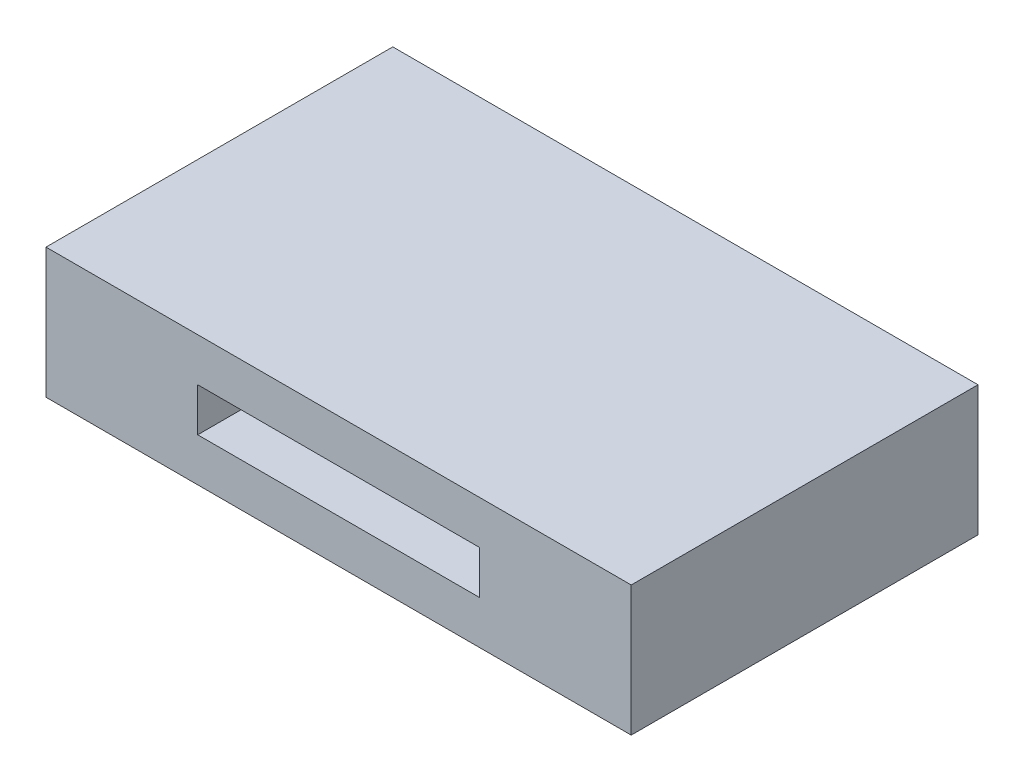
ISO-10303-21;
HEADER;
FILE_DESCRIPTION(('STEP AP214'),'2;1');
FILE_NAME('part.step','',(''),(''),'','','');
FILE_SCHEMA(('AUTOMOTIVE_DESIGN { 1 0 10303 214 1 1 1 1 }'));
ENDSEC;
DATA;
#1=APPLICATION_CONTEXT('core data for automotive mechanical design processes');
#2=APPLICATION_PROTOCOL_DEFINITION('international standard','automotive_design',2000,#1);
#3=PRODUCT_CONTEXT('',#1,'mechanical');
#4=PRODUCT('Part','Part','',(#3));
#5=PRODUCT_RELATED_PRODUCT_CATEGORY('part','',(#4));
#6=PRODUCT_DEFINITION_FORMATION('','',#4);
#7=PRODUCT_DEFINITION_CONTEXT('part definition',#1,'design');
#8=PRODUCT_DEFINITION('design','',#6,#7);
#9=PRODUCT_DEFINITION_SHAPE('','',#8);
#10=(LENGTH_UNIT() NAMED_UNIT(*) SI_UNIT(.MILLI.,.METRE.));
#11=(NAMED_UNIT(*) PLANE_ANGLE_UNIT() SI_UNIT($,.RADIAN.));
#12=(NAMED_UNIT(*) SI_UNIT($,.STERADIAN.) SOLID_ANGLE_UNIT());
#13=UNCERTAINTY_MEASURE_WITH_UNIT(LENGTH_MEASURE(1.E-05),#10,'distance_accuracy_value','');
#14=(GEOMETRIC_REPRESENTATION_CONTEXT(3) GLOBAL_UNCERTAINTY_ASSIGNED_CONTEXT((#13)) GLOBAL_UNIT_ASSIGNED_CONTEXT((#10,
#11,#12)) REPRESENTATION_CONTEXT('',''));
#15=CARTESIAN_POINT('',(0.,0.,0.));
#16=DIRECTION('',(0.,0.,1.));
#17=DIRECTION('',(1.,0.,0.));
#18=AXIS2_PLACEMENT_3D('',#15,#16,#17);
#19=CARTESIAN_POINT('',(0.,0.,16.));
#20=DIRECTION('',(0.,0.,-1.));
#21=DIRECTION('',(-1.,0.,0.));
#22=AXIS2_PLACEMENT_3D('',#19,#20,#21);
#23=PLANE('',#22);
#24=DIRECTION('',(0.,1.,0.));
#25=VECTOR('',#24,1.);
#26=CARTESIAN_POINT('',(13.5,-3.,16.));
#27=LINE('',#26,#25);
#28=CARTESIAN_POINT('',(13.5,-3.,16.));
#29=VERTEX_POINT('',#28);
#30=CARTESIAN_POINT('',(13.5,3.,16.));
#31=VERTEX_POINT('',#30);
#32=EDGE_CURVE('E153',#29,#31,#27,.T.);
#33=ORIENTED_EDGE('',*,*,#32,.T.);
#34=DIRECTION('',(-1.,0.,0.));
#35=VECTOR('',#34,1.);
#36=CARTESIAN_POINT('',(-13.5,3.,16.));
#37=LINE('',#36,#35);
#38=CARTESIAN_POINT('',(-13.5,3.,16.));
#39=VERTEX_POINT('',#38);
#40=EDGE_CURVE('E157',#31,#39,#37,.T.);
#41=ORIENTED_EDGE('',*,*,#40,.T.);
#42=DIRECTION('',(0.,-1.,0.));
#43=VECTOR('',#42,1.);
#44=CARTESIAN_POINT('',(-13.5,-3.,16.));
#45=LINE('',#44,#43);
#46=CARTESIAN_POINT('',(-13.5,-3.,16.));
#47=VERTEX_POINT('',#46);
#48=EDGE_CURVE('E161',#39,#47,#45,.T.);
#49=ORIENTED_EDGE('',*,*,#48,.T.);
#50=DIRECTION('',(1.,0.,0.));
#51=VECTOR('',#50,1.);
#52=CARTESIAN_POINT('',(-13.5,-3.,16.));
#53=LINE('',#52,#51);
#54=EDGE_CURVE('E164',#47,#29,#53,.T.);
#55=ORIENTED_EDGE('',*,*,#54,.T.);
#56=EDGE_LOOP('',(#33,#41,#49,#55));
#57=FACE_BOUND('',#56,.T.);
#58=DIRECTION('',(0.,1.,0.));
#59=VECTOR('',#58,1.);
#60=CARTESIAN_POINT('',(6.5,-1.,16.));
#61=LINE('',#60,#59);
#62=CARTESIAN_POINT('',(6.5,-1.,16.));
#63=VERTEX_POINT('',#62);
#64=CARTESIAN_POINT('',(6.5,1.,16.));
#65=VERTEX_POINT('',#64);
#66=EDGE_CURVE('E105',#63,#65,#61,.T.);
#67=ORIENTED_EDGE('',*,*,#66,.F.);
#68=DIRECTION('',(1.,0.,0.));
#69=VECTOR('',#68,1.);
#70=CARTESIAN_POINT('',(-6.5,-1.,16.));
#71=LINE('',#70,#69);
#72=CARTESIAN_POINT('',(-6.5,-1.,16.));
#73=VERTEX_POINT('',#72);
#74=EDGE_CURVE('E131',#73,#63,#71,.T.);
#75=ORIENTED_EDGE('',*,*,#74,.F.);
#76=DIRECTION('',(0.,-1.,0.));
#77=VECTOR('',#76,1.);
#78=CARTESIAN_POINT('',(-6.5,-1.,16.));
#79=LINE('',#78,#77);
#80=CARTESIAN_POINT('',(-6.5,1.,16.));
#81=VERTEX_POINT('',#80);
#82=EDGE_CURVE('E127',#81,#73,#79,.T.);
#83=ORIENTED_EDGE('',*,*,#82,.F.);
#84=DIRECTION('',(-1.,0.,0.));
#85=VECTOR('',#84,1.);
#86=CARTESIAN_POINT('',(-6.5,1.,16.));
#87=LINE('',#86,#85);
#88=EDGE_CURVE('E114',#65,#81,#87,.T.);
#89=ORIENTED_EDGE('',*,*,#88,.F.);
#90=EDGE_LOOP('',(#67,#75,#83,#89));
#91=FACE_BOUND('',#90,.T.);
#92=ADVANCED_FACE('F39',(#57,#91),#23,.F.);
#93=CARTESIAN_POINT('',(0.,0.,0.));
#94=DIRECTION('',(0.,0.,-1.));
#95=DIRECTION('',(-1.,0.,0.));
#96=AXIS2_PLACEMENT_3D('',#93,#94,#95);
#97=PLANE('',#96);
#98=DIRECTION('',(0.,1.,0.));
#99=VECTOR('',#98,1.);
#100=CARTESIAN_POINT('',(13.5,-3.,0.));
#101=LINE('',#100,#99);
#102=CARTESIAN_POINT('',(13.5,-3.,0.));
#103=VERTEX_POINT('',#102);
#104=CARTESIAN_POINT('',(13.5,3.,0.));
#105=VERTEX_POINT('',#104);
#106=EDGE_CURVE('E123',#103,#105,#101,.T.);
#107=ORIENTED_EDGE('',*,*,#106,.F.);
#108=DIRECTION('',(1.,0.,0.));
#109=VECTOR('',#108,1.);
#110=CARTESIAN_POINT('',(-13.5,-3.,0.));
#111=LINE('',#110,#109);
#112=CARTESIAN_POINT('',(-13.5,-3.,0.));
#113=VERTEX_POINT('',#112);
#114=EDGE_CURVE('E158',#113,#103,#111,.T.);
#115=ORIENTED_EDGE('',*,*,#114,.F.);
#116=DIRECTION('',(0.,-1.,0.));
#117=VECTOR('',#116,1.);
#118=CARTESIAN_POINT('',(-13.5,-3.,0.));
#119=LINE('',#118,#117);
#120=CARTESIAN_POINT('',(-13.5,3.,0.));
#121=VERTEX_POINT('',#120);
#122=EDGE_CURVE('E174',#121,#113,#119,.T.);
#123=ORIENTED_EDGE('',*,*,#122,.F.);
#124=DIRECTION('',(-1.,0.,0.));
#125=VECTOR('',#124,1.);
#126=CARTESIAN_POINT('',(-13.5,3.,0.));
#127=LINE('',#126,#125);
#128=EDGE_CURVE('E171',#105,#121,#127,.T.);
#129=ORIENTED_EDGE('',*,*,#128,.F.);
#130=EDGE_LOOP('',(#107,#115,#123,#129));
#131=FACE_BOUND('',#130,.T.);
#132=DIRECTION('',(1.,0.,0.));
#133=VECTOR('',#132,1.);
#134=CARTESIAN_POINT('',(-6.5,-1.,0.));
#135=LINE('',#134,#133);
#136=CARTESIAN_POINT('',(-6.5,-1.,0.));
#137=VERTEX_POINT('',#136);
#138=CARTESIAN_POINT('',(6.5,-1.,0.));
#139=VERTEX_POINT('',#138);
#140=EDGE_CURVE('E115',#137,#139,#135,.T.);
#141=ORIENTED_EDGE('',*,*,#140,.T.);
#142=DIRECTION('',(0.,1.,0.));
#143=VECTOR('',#142,1.);
#144=CARTESIAN_POINT('',(6.5,-1.,0.));
#145=LINE('',#144,#143);
#146=CARTESIAN_POINT('',(6.5,1.,0.));
#147=VERTEX_POINT('',#146);
#148=EDGE_CURVE('E63',#139,#147,#145,.T.);
#149=ORIENTED_EDGE('',*,*,#148,.T.);
#150=DIRECTION('',(-1.,0.,0.));
#151=VECTOR('',#150,1.);
#152=CARTESIAN_POINT('',(-6.5,1.,0.));
#153=LINE('',#152,#151);
#154=CARTESIAN_POINT('',(-6.5,1.,0.));
#155=VERTEX_POINT('',#154);
#156=EDGE_CURVE('E121',#147,#155,#153,.T.);
#157=ORIENTED_EDGE('',*,*,#156,.T.);
#158=DIRECTION('',(0.,-1.,0.));
#159=VECTOR('',#158,1.);
#160=CARTESIAN_POINT('',(-6.5,-1.,0.));
#161=LINE('',#160,#159);
#162=EDGE_CURVE('E140',#155,#137,#161,.T.);
#163=ORIENTED_EDGE('',*,*,#162,.T.);
#164=EDGE_LOOP('',(#141,#149,#157,#163));
#165=FACE_BOUND('',#164,.T.);
#166=ADVANCED_FACE('F197',(#131,#165),#97,.T.);
#167=CARTESIAN_POINT('',(13.5,-3.,16.));
#168=DIRECTION('',(-1.,0.,0.));
#169=DIRECTION('',(0.,0.,1.));
#170=AXIS2_PLACEMENT_3D('',#167,#168,#169);
#171=PLANE('',#170);
#172=ORIENTED_EDGE('',*,*,#106,.T.);
#173=DIRECTION('',(0.,0.,-1.));
#174=VECTOR('',#173,1.);
#175=CARTESIAN_POINT('',(13.5,3.,16.));
#176=LINE('',#175,#174);
#177=EDGE_CURVE('E11',#31,#105,#176,.T.);
#178=ORIENTED_EDGE('',*,*,#177,.F.);
#179=ORIENTED_EDGE('',*,*,#32,.F.);
#180=DIRECTION('',(0.,0.,-1.));
#181=VECTOR('',#180,1.);
#182=CARTESIAN_POINT('',(13.5,-3.,16.));
#183=LINE('',#182,#181);
#184=EDGE_CURVE('E167',#29,#103,#183,.T.);
#185=ORIENTED_EDGE('',*,*,#184,.T.);
#186=EDGE_LOOP('',(#172,#178,#179,#185));
#187=FACE_BOUND('',#186,.T.);
#188=ADVANCED_FACE('F41',(#187),#171,.F.);
#189=CARTESIAN_POINT('',(-13.5,3.,16.));
#190=DIRECTION('',(0.,-1.,0.));
#191=DIRECTION('',(0.,0.,-1.));
#192=AXIS2_PLACEMENT_3D('',#189,#190,#191);
#193=PLANE('',#192);
#194=ORIENTED_EDGE('',*,*,#128,.T.);
#195=DIRECTION('',(0.,0.,-1.));
#196=VECTOR('',#195,1.);
#197=CARTESIAN_POINT('',(-13.5,3.,16.));
#198=LINE('',#197,#196);
#199=EDGE_CURVE('E48',#39,#121,#198,.T.);
#200=ORIENTED_EDGE('',*,*,#199,.F.);
#201=ORIENTED_EDGE('',*,*,#40,.F.);
#202=ORIENTED_EDGE('',*,*,#177,.T.);
#203=EDGE_LOOP('',(#194,#200,#201,#202));
#204=FACE_BOUND('',#203,.T.);
#205=ADVANCED_FACE('F207',(#204),#193,.F.);
#206=CARTESIAN_POINT('',(-13.5,-3.,16.));
#207=DIRECTION('',(1.,0.,0.));
#208=DIRECTION('',(0.,0.,-1.));
#209=AXIS2_PLACEMENT_3D('',#206,#207,#208);
#210=PLANE('',#209);
#211=ORIENTED_EDGE('',*,*,#122,.T.);
#212=DIRECTION('',(0.,0.,-1.));
#213=VECTOR('',#212,1.);
#214=CARTESIAN_POINT('',(-13.5,-3.,16.));
#215=LINE('',#214,#213);
#216=EDGE_CURVE('E182',#47,#113,#215,.T.);
#217=ORIENTED_EDGE('',*,*,#216,.F.);
#218=ORIENTED_EDGE('',*,*,#48,.F.);
#219=ORIENTED_EDGE('',*,*,#199,.T.);
#220=EDGE_LOOP('',(#211,#217,#218,#219));
#221=FACE_BOUND('',#220,.T.);
#222=ADVANCED_FACE('F191',(#221),#210,.F.);
#223=CARTESIAN_POINT('',(-13.5,-3.,16.));
#224=DIRECTION('',(0.,1.,0.));
#225=DIRECTION('',(0.,0.,1.));
#226=AXIS2_PLACEMENT_3D('',#223,#224,#225);
#227=PLANE('',#226);
#228=ORIENTED_EDGE('',*,*,#114,.T.);
#229=ORIENTED_EDGE('',*,*,#184,.F.);
#230=ORIENTED_EDGE('',*,*,#54,.F.);
#231=ORIENTED_EDGE('',*,*,#216,.T.);
#232=EDGE_LOOP('',(#228,#229,#230,#231));
#233=FACE_BOUND('',#232,.T.);
#234=ADVANCED_FACE('F201',(#233),#227,.F.);
#235=CARTESIAN_POINT('',(6.5,-1.,16.));
#236=DIRECTION('',(-1.,0.,0.));
#237=DIRECTION('',(0.,0.,1.));
#238=AXIS2_PLACEMENT_3D('',#235,#236,#237);
#239=PLANE('',#238);
#240=ORIENTED_EDGE('',*,*,#148,.F.);
#241=DIRECTION('',(0.,0.,-1.));
#242=VECTOR('',#241,1.);
#243=CARTESIAN_POINT('',(6.5,-1.,16.));
#244=LINE('',#243,#242);
#245=EDGE_CURVE('E109',#63,#139,#244,.T.);
#246=ORIENTED_EDGE('',*,*,#245,.F.);
#247=ORIENTED_EDGE('',*,*,#66,.T.);
#248=DIRECTION('',(0.,0.,-1.));
#249=VECTOR('',#248,1.);
#250=CARTESIAN_POINT('',(6.5,1.,16.));
#251=LINE('',#250,#249);
#252=EDGE_CURVE('E108',#65,#147,#251,.T.);
#253=ORIENTED_EDGE('',*,*,#252,.T.);
#254=EDGE_LOOP('',(#240,#246,#247,#253));
#255=FACE_BOUND('',#254,.T.);
#256=ADVANCED_FACE('F107',(#255),#239,.T.);
#257=CARTESIAN_POINT('',(-6.5,1.,16.));
#258=DIRECTION('',(0.,-1.,0.));
#259=DIRECTION('',(0.,0.,-1.));
#260=AXIS2_PLACEMENT_3D('',#257,#258,#259);
#261=PLANE('',#260);
#262=ORIENTED_EDGE('',*,*,#156,.F.);
#263=ORIENTED_EDGE('',*,*,#252,.F.);
#264=ORIENTED_EDGE('',*,*,#88,.T.);
#265=DIRECTION('',(0.,0.,-1.));
#266=VECTOR('',#265,1.);
#267=CARTESIAN_POINT('',(-6.5,1.,16.));
#268=LINE('',#267,#266);
#269=EDGE_CURVE('E124',#81,#155,#268,.T.);
#270=ORIENTED_EDGE('',*,*,#269,.T.);
#271=EDGE_LOOP('',(#262,#263,#264,#270));
#272=FACE_BOUND('',#271,.T.);
#273=ADVANCED_FACE('F118',(#272),#261,.T.);
#274=CARTESIAN_POINT('',(-6.5,-1.,16.));
#275=DIRECTION('',(1.,0.,0.));
#276=DIRECTION('',(0.,0.,-1.));
#277=AXIS2_PLACEMENT_3D('',#274,#275,#276);
#278=PLANE('',#277);
#279=ORIENTED_EDGE('',*,*,#162,.F.);
#280=ORIENTED_EDGE('',*,*,#269,.F.);
#281=ORIENTED_EDGE('',*,*,#82,.T.);
#282=DIRECTION('',(0.,0.,-1.));
#283=VECTOR('',#282,1.);
#284=CARTESIAN_POINT('',(-6.5,-1.,16.));
#285=LINE('',#284,#283);
#286=EDGE_CURVE('E55',#73,#137,#285,.T.);
#287=ORIENTED_EDGE('',*,*,#286,.T.);
#288=EDGE_LOOP('',(#279,#280,#281,#287));
#289=FACE_BOUND('',#288,.T.);
#290=ADVANCED_FACE('F230',(#289),#278,.T.);
#291=CARTESIAN_POINT('',(-6.5,-1.,16.));
#292=DIRECTION('',(0.,1.,0.));
#293=DIRECTION('',(0.,0.,1.));
#294=AXIS2_PLACEMENT_3D('',#291,#292,#293);
#295=PLANE('',#294);
#296=ORIENTED_EDGE('',*,*,#140,.F.);
#297=ORIENTED_EDGE('',*,*,#286,.F.);
#298=ORIENTED_EDGE('',*,*,#74,.T.);
#299=ORIENTED_EDGE('',*,*,#245,.T.);
#300=EDGE_LOOP('',(#296,#297,#298,#299));
#301=FACE_BOUND('',#300,.T.);
#302=ADVANCED_FACE('F234',(#301),#295,.T.);
#303=CLOSED_SHELL('',(#92,#166,#188,#205,#222,#234,#256,#273,#290,#302));
#304=MANIFOLD_SOLID_BREP('B2',#303);
#305=ADVANCED_BREP_SHAPE_REPRESENTATION('',(#18,#304),#14);
#306=SHAPE_DEFINITION_REPRESENTATION(#9,#305);
ENDSEC;
END-ISO-10303-21;
